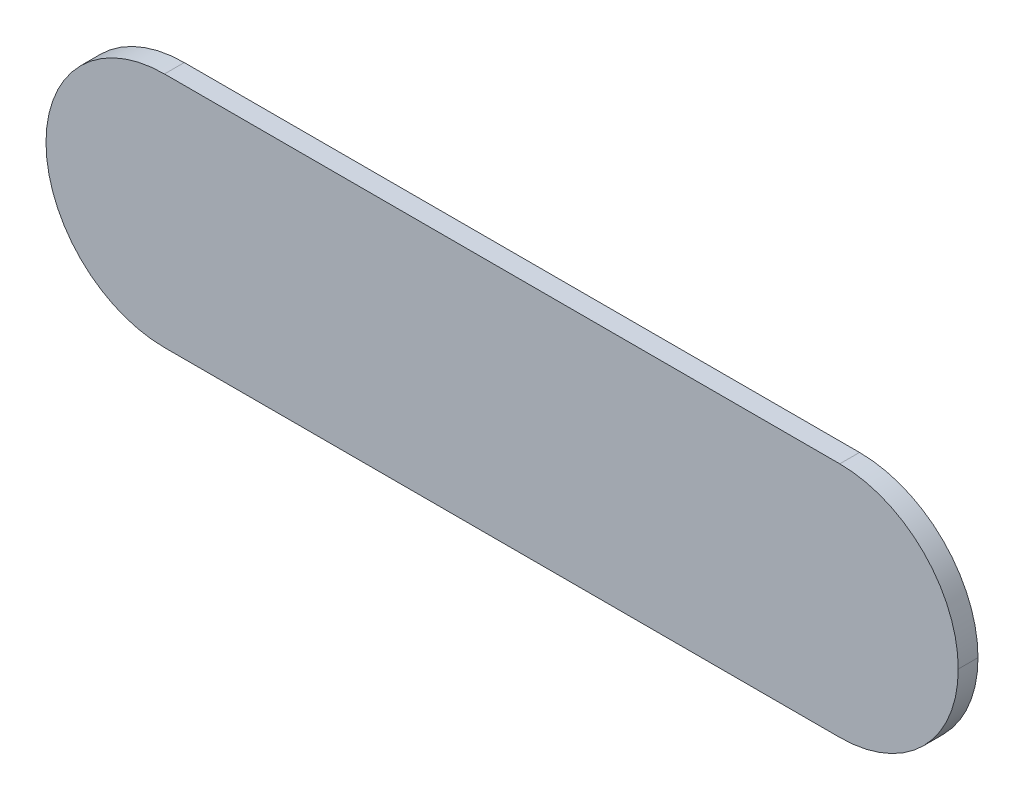
ISO-10303-21;
HEADER;
FILE_DESCRIPTION(('STEP AP214'),'2;1');
FILE_NAME('part.step','',(''),(''),'','','');
FILE_SCHEMA(('AUTOMOTIVE_DESIGN { 1 0 10303 214 1 1 1 1 }'));
ENDSEC;
DATA;
#1=APPLICATION_CONTEXT('core data for automotive mechanical design processes');
#2=APPLICATION_PROTOCOL_DEFINITION('international standard','automotive_design',2000,#1);
#3=PRODUCT_CONTEXT('',#1,'mechanical');
#4=PRODUCT('Part','Part','',(#3));
#5=PRODUCT_RELATED_PRODUCT_CATEGORY('part','',(#4));
#6=PRODUCT_DEFINITION_FORMATION('','',#4);
#7=PRODUCT_DEFINITION_CONTEXT('part definition',#1,'design');
#8=PRODUCT_DEFINITION('design','',#6,#7);
#9=PRODUCT_DEFINITION_SHAPE('','',#8);
#10=(LENGTH_UNIT() NAMED_UNIT(*) SI_UNIT(.MILLI.,.METRE.));
#11=(NAMED_UNIT(*) PLANE_ANGLE_UNIT() SI_UNIT($,.RADIAN.));
#12=(NAMED_UNIT(*) SI_UNIT($,.STERADIAN.) SOLID_ANGLE_UNIT());
#13=UNCERTAINTY_MEASURE_WITH_UNIT(LENGTH_MEASURE(1.E-05),#10,'distance_accuracy_value','');
#14=(GEOMETRIC_REPRESENTATION_CONTEXT(3) GLOBAL_UNCERTAINTY_ASSIGNED_CONTEXT((#13)) GLOBAL_UNIT_ASSIGNED_CONTEXT((#10,
#11,#12)) REPRESENTATION_CONTEXT('',''));
#15=CARTESIAN_POINT('',(0.,0.,0.));
#16=DIRECTION('',(0.,0.,1.));
#17=DIRECTION('',(1.,0.,0.));
#18=AXIS2_PLACEMENT_3D('',#15,#16,#17);
#19=CARTESIAN_POINT('',(38.070148925781,46.312998046875,1.1723000001));
#20=DIRECTION('',(0.,0.,1.));
#21=DIRECTION('',(1.,0.,0.));
#22=AXIS2_PLACEMENT_3D('',#19,#20,#21);
#23=PLANE('',#22);
#24=CARTESIAN_POINT('',(38.287297363242,46.312998046875,1.1723000001));
#25=DIRECTION('',(0.,0.,-1.));
#26=DIRECTION('',(1.,0.,0.));
#27=AXIS2_PLACEMENT_3D('',#24,#25,#26);
#28=CIRCLE('',#27,0.07620117191411);
#29=CARTESIAN_POINT('',(38.287298583965,46.38919921875,1.1723000001));
#30=VERTEX_POINT('',#29);
#31=CARTESIAN_POINT('',(38.363498535156,46.312998046875,1.1723000001));
#32=VERTEX_POINT('',#31);
#33=EDGE_CURVE('E21',#30,#32,#28,.T.);
#34=ORIENTED_EDGE('',*,*,#33,.F.);
#35=DIRECTION('',(-1.,0.,0.));
#36=VECTOR('',#35,1.);
#37=CARTESIAN_POINT('',(37.852998046875,46.38919921875,1.1723000001));
#38=LINE('',#37,#36);
#39=CARTESIAN_POINT('',(37.852999267598,46.38919921875,1.1723000001));
#40=VERTEX_POINT('',#39);
#41=EDGE_CURVE('E126',#30,#40,#38,.T.);
#42=ORIENTED_EDGE('',*,*,#41,.T.);
#43=CARTESIAN_POINT('',(37.85300048832,46.312998046875,1.1723000001));
#44=DIRECTION('',(0.,0.,-1.));
#45=DIRECTION('',(1.,0.,0.));
#46=AXIS2_PLACEMENT_3D('',#43,#44,#45);
#47=CIRCLE('',#46,0.07620117191411);
#48=CARTESIAN_POINT('',(37.852999267598,46.236796875,1.1723000001));
#49=VERTEX_POINT('',#48);
#50=EDGE_CURVE('E89',#49,#40,#47,.T.);
#51=ORIENTED_EDGE('',*,*,#50,.F.);
#52=DIRECTION('',(1.,0.,0.));
#53=VECTOR('',#52,1.);
#54=CARTESIAN_POINT('',(38.287299804688,46.236796875,1.1723000001));
#55=LINE('',#54,#53);
#56=CARTESIAN_POINT('',(38.287298583965,46.236796875,1.1723000001));
#57=VERTEX_POINT('',#56);
#58=EDGE_CURVE('E11',#49,#57,#55,.T.);
#59=ORIENTED_EDGE('',*,*,#58,.T.);
#60=CARTESIAN_POINT('',(38.287297363242,46.312998046875,1.1723000001));
#61=DIRECTION('',(0.,0.,-1.));
#62=DIRECTION('',(1.,0.,0.));
#63=AXIS2_PLACEMENT_3D('',#60,#61,#62);
#64=CIRCLE('',#63,0.07620117191411);
#65=EDGE_CURVE('E116',#32,#57,#64,.T.);
#66=ORIENTED_EDGE('',*,*,#65,.F.);
#67=EDGE_LOOP('',(#34,#42,#51,#59,#66));
#68=FACE_BOUND('',#67,.T.);
#69=ADVANCED_FACE('F17',(#68),#23,.T.);
#70=CARTESIAN_POINT('',(38.287299804688,46.236796875,1.1596000001));
#71=DIRECTION('',(0.,1.,0.));
#72=DIRECTION('',(1.,0.,0.));
#73=AXIS2_PLACEMENT_3D('',#70,#71,#72);
#74=PLANE('',#73);
#75=DIRECTION('',(0.,0.,1.));
#76=VECTOR('',#75,1.);
#77=CARTESIAN_POINT('',(37.852998046875,46.236796875,1.1596000001));
#78=LINE('',#77,#76);
#79=CARTESIAN_POINT('',(37.852999267598,46.236796875,1.1596000001));
#80=VERTEX_POINT('',#79);
#81=EDGE_CURVE('E75',#80,#49,#78,.T.);
#82=ORIENTED_EDGE('',*,*,#81,.F.);
#83=DIRECTION('',(1.,0.,0.));
#84=VECTOR('',#83,1.);
#85=CARTESIAN_POINT('',(38.070148925781,46.236796875,1.1596000001));
#86=LINE('',#85,#84);
#87=CARTESIAN_POINT('',(38.287298583965,46.236796875,1.1596000001));
#88=VERTEX_POINT('',#87);
#89=EDGE_CURVE('E100',#80,#88,#86,.T.);
#90=ORIENTED_EDGE('',*,*,#89,.T.);
#91=DIRECTION('',(0.,0.,-1.));
#92=VECTOR('',#91,1.);
#93=CARTESIAN_POINT('',(38.287299804688,46.236796875,1.1596000001));
#94=LINE('',#93,#92);
#95=EDGE_CURVE('E107',#57,#88,#94,.T.);
#96=ORIENTED_EDGE('',*,*,#95,.F.);
#97=ORIENTED_EDGE('',*,*,#58,.F.);
#98=EDGE_LOOP('',(#82,#90,#96,#97));
#99=FACE_BOUND('',#98,.T.);
#100=ADVANCED_FACE('F144',(#99),#74,.F.);
#101=CARTESIAN_POINT('',(38.287297363242,46.312998046875,1.1596000001));
#102=DIRECTION('',(0.,0.,1.));
#103=DIRECTION('',(1.,0.,0.));
#104=AXIS2_PLACEMENT_3D('',#101,#102,#103);
#105=CYLINDRICAL_SURFACE('',#104,0.07620117191411);
#106=DIRECTION('',(0.,0.,1.));
#107=VECTOR('',#106,1.);
#108=CARTESIAN_POINT('',(38.363498535156,46.312998046875,1.1596000001));
#109=LINE('',#108,#107);
#110=CARTESIAN_POINT('',(38.363498535156,46.312998046875,1.1596000001));
#111=VERTEX_POINT('',#110);
#112=EDGE_CURVE('E122',#111,#32,#109,.T.);
#113=ORIENTED_EDGE('',*,*,#112,.F.);
#114=CARTESIAN_POINT('',(38.287297363242,46.312998046875,1.1596000001));
#115=DIRECTION('',(0.,0.,1.));
#116=DIRECTION('',(1.,0.,0.));
#117=AXIS2_PLACEMENT_3D('',#114,#115,#116);
#118=CIRCLE('',#117,0.07620117191411);
#119=CARTESIAN_POINT('',(38.287298583965,46.38919921875,1.1596000001));
#120=VERTEX_POINT('',#119);
#121=EDGE_CURVE('E106',#111,#120,#118,.T.);
#122=ORIENTED_EDGE('',*,*,#121,.T.);
#123=DIRECTION('',(0.,0.,1.));
#124=VECTOR('',#123,1.);
#125=CARTESIAN_POINT('',(38.287299804688,46.38919921875,1.1596000001));
#126=LINE('',#125,#124);
#127=EDGE_CURVE('E93',#120,#30,#126,.T.);
#128=ORIENTED_EDGE('',*,*,#127,.T.);
#129=ORIENTED_EDGE('',*,*,#33,.T.);
#130=EDGE_LOOP('',(#113,#122,#128,#129));
#131=FACE_BOUND('',#130,.T.);
#132=ADVANCED_FACE('F151',(#131),#105,.T.);
#133=CARTESIAN_POINT('',(37.852998046875,46.38919921875,1.1596000001));
#134=DIRECTION('',(0.,-1.,0.));
#135=DIRECTION('',(0.,0.,-1.));
#136=AXIS2_PLACEMENT_3D('',#133,#134,#135);
#137=PLANE('',#136);
#138=ORIENTED_EDGE('',*,*,#127,.F.);
#139=DIRECTION('',(-1.,0.,0.));
#140=VECTOR('',#139,1.);
#141=CARTESIAN_POINT('',(38.070148925781,46.38919921875,1.1596000001));
#142=LINE('',#141,#140);
#143=CARTESIAN_POINT('',(37.852999267598,46.38919921875,1.1596000001));
#144=VERTEX_POINT('',#143);
#145=EDGE_CURVE('E98',#120,#144,#142,.T.);
#146=ORIENTED_EDGE('',*,*,#145,.T.);
#147=DIRECTION('',(0.,0.,-1.));
#148=VECTOR('',#147,1.);
#149=CARTESIAN_POINT('',(37.852998046875,46.38919921875,1.1596000001));
#150=LINE('',#149,#148);
#151=EDGE_CURVE('E85',#40,#144,#150,.T.);
#152=ORIENTED_EDGE('',*,*,#151,.F.);
#153=ORIENTED_EDGE('',*,*,#41,.F.);
#154=EDGE_LOOP('',(#138,#146,#152,#153));
#155=FACE_BOUND('',#154,.T.);
#156=ADVANCED_FACE('F103',(#155),#137,.F.);
#157=CARTESIAN_POINT('',(37.85300048832,46.312998046875,1.1596000001));
#158=DIRECTION('',(0.,0.,1.));
#159=DIRECTION('',(1.,0.,0.));
#160=AXIS2_PLACEMENT_3D('',#157,#158,#159);
#161=CYLINDRICAL_SURFACE('',#160,0.07620117191411);
#162=CARTESIAN_POINT('',(37.85300048832,46.312998046875,1.1596000001));
#163=DIRECTION('',(0.,0.,1.));
#164=DIRECTION('',(1.,0.,0.));
#165=AXIS2_PLACEMENT_3D('',#162,#163,#164);
#166=CIRCLE('',#165,0.07620117191411);
#167=EDGE_CURVE('E87',#144,#80,#166,.T.);
#168=ORIENTED_EDGE('',*,*,#167,.T.);
#169=ORIENTED_EDGE('',*,*,#81,.T.);
#170=ORIENTED_EDGE('',*,*,#50,.T.);
#171=ORIENTED_EDGE('',*,*,#151,.T.);
#172=EDGE_LOOP('',(#168,#169,#170,#171));
#173=FACE_BOUND('',#172,.T.);
#174=ADVANCED_FACE('F19',(#173),#161,.T.);
#175=CARTESIAN_POINT('',(38.070148925781,46.312998046875,1.1596000001));
#176=DIRECTION('',(0.,0.,1.));
#177=DIRECTION('',(1.,0.,0.));
#178=AXIS2_PLACEMENT_3D('',#175,#176,#177);
#179=PLANE('',#178);
#180=ORIENTED_EDGE('',*,*,#145,.F.);
#181=ORIENTED_EDGE('',*,*,#121,.F.);
#182=CARTESIAN_POINT('',(38.287297363242,46.312998046875,1.1596000001));
#183=DIRECTION('',(0.,0.,1.));
#184=DIRECTION('',(1.,0.,0.));
#185=AXIS2_PLACEMENT_3D('',#182,#183,#184);
#186=CIRCLE('',#185,0.07620117191411);
#187=EDGE_CURVE('E119',#88,#111,#186,.T.);
#188=ORIENTED_EDGE('',*,*,#187,.F.);
#189=ORIENTED_EDGE('',*,*,#89,.F.);
#190=ORIENTED_EDGE('',*,*,#167,.F.);
#191=EDGE_LOOP('',(#180,#181,#188,#189,#190));
#192=FACE_BOUND('',#191,.T.);
#193=ADVANCED_FACE('F97',(#192),#179,.F.);
#194=CARTESIAN_POINT('',(38.287297363242,46.312998046875,1.1596000001));
#195=DIRECTION('',(0.,0.,1.));
#196=DIRECTION('',(1.,0.,0.));
#197=AXIS2_PLACEMENT_3D('',#194,#195,#196);
#198=CYLINDRICAL_SURFACE('',#197,0.07620117191411);
#199=ORIENTED_EDGE('',*,*,#187,.T.);
#200=ORIENTED_EDGE('',*,*,#112,.T.);
#201=ORIENTED_EDGE('',*,*,#65,.T.);
#202=ORIENTED_EDGE('',*,*,#95,.T.);
#203=EDGE_LOOP('',(#199,#200,#201,#202));
#204=FACE_BOUND('',#203,.T.);
#205=ADVANCED_FACE('F142',(#204),#198,.T.);
#206=CLOSED_SHELL('',(#69,#100,#132,#156,#174,#193,#205));
#207=MANIFOLD_SOLID_BREP('B1',#206);
#208=ADVANCED_BREP_SHAPE_REPRESENTATION('',(#18,#207),#14);
#209=SHAPE_DEFINITION_REPRESENTATION(#9,#208);
ENDSEC;
END-ISO-10303-21;
